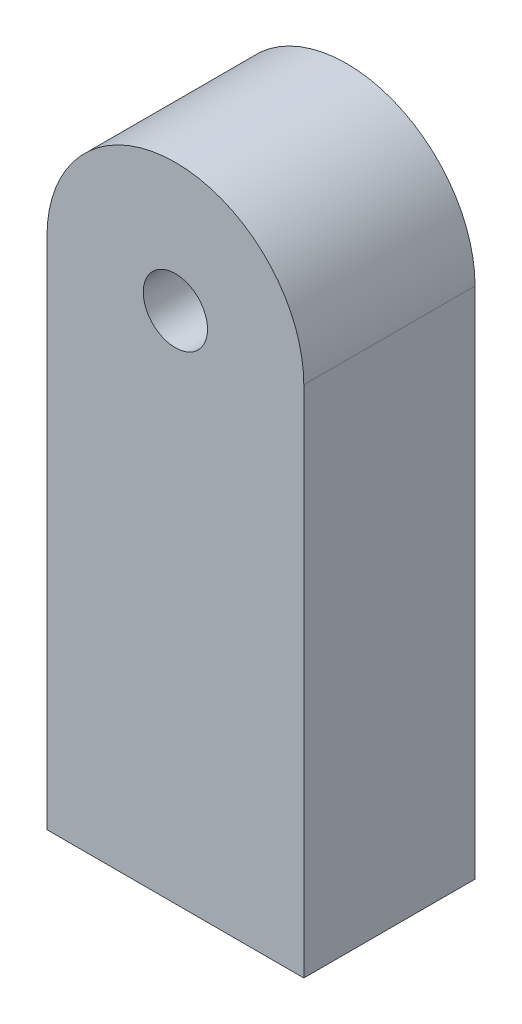
ISO-10303-21;
HEADER;
FILE_DESCRIPTION(('STEP AP214'),'2;1');
FILE_NAME('part.step','',(''),(''),'','','');
FILE_SCHEMA(('AUTOMOTIVE_DESIGN { 1 0 10303 214 1 1 1 1 }'));
ENDSEC;
DATA;
#1=APPLICATION_CONTEXT('core data for automotive mechanical design processes');
#2=APPLICATION_PROTOCOL_DEFINITION('international standard','automotive_design',2000,#1);
#3=PRODUCT_CONTEXT('',#1,'mechanical');
#4=PRODUCT('Part','Part','',(#3));
#5=PRODUCT_RELATED_PRODUCT_CATEGORY('part','',(#4));
#6=PRODUCT_DEFINITION_FORMATION('','',#4);
#7=PRODUCT_DEFINITION_CONTEXT('part definition',#1,'design');
#8=PRODUCT_DEFINITION('design','',#6,#7);
#9=PRODUCT_DEFINITION_SHAPE('','',#8);
#10=(LENGTH_UNIT() NAMED_UNIT(*) SI_UNIT(.MILLI.,.METRE.));
#11=(NAMED_UNIT(*) PLANE_ANGLE_UNIT() SI_UNIT($,.RADIAN.));
#12=(NAMED_UNIT(*) SI_UNIT($,.STERADIAN.) SOLID_ANGLE_UNIT());
#13=UNCERTAINTY_MEASURE_WITH_UNIT(LENGTH_MEASURE(1.E-05),#10,'distance_accuracy_value','');
#14=(GEOMETRIC_REPRESENTATION_CONTEXT(3) GLOBAL_UNCERTAINTY_ASSIGNED_CONTEXT((#13)) GLOBAL_UNIT_ASSIGNED_CONTEXT((#10,
#11,#12)) REPRESENTATION_CONTEXT('',''));
#15=CARTESIAN_POINT('',(0.,0.,0.));
#16=DIRECTION('',(0.,0.,1.));
#17=DIRECTION('',(1.,0.,0.));
#18=AXIS2_PLACEMENT_3D('',#15,#16,#17);
#19=CARTESIAN_POINT('',(19.05,76.2,12.7));
#20=DIRECTION('',(-1.,0.,0.));
#21=DIRECTION('',(0.,0.,1.));
#22=AXIS2_PLACEMENT_3D('',#19,#20,#21);
#23=PLANE('',#22);
#24=DIRECTION('',(0.,0.,-1.));
#25=VECTOR('',#24,1.);
#26=CARTESIAN_POINT('',(19.05,0.,12.7));
#27=LINE('',#26,#25);
#28=CARTESIAN_POINT('',(19.05,0.,12.7));
#29=VERTEX_POINT('',#28);
#30=CARTESIAN_POINT('',(19.05,0.,-12.7));
#31=VERTEX_POINT('',#30);
#32=EDGE_CURVE('E83',#29,#31,#27,.T.);
#33=ORIENTED_EDGE('',*,*,#32,.T.);
#34=DIRECTION('',(0.,-1.,0.));
#35=VECTOR('',#34,1.);
#36=CARTESIAN_POINT('',(19.05,76.2,-12.7));
#37=LINE('',#36,#35);
#38=CARTESIAN_POINT('',(19.05,76.2,-12.7));
#39=VERTEX_POINT('',#38);
#40=EDGE_CURVE('E11',#39,#31,#37,.T.);
#41=ORIENTED_EDGE('',*,*,#40,.F.);
#42=DIRECTION('',(0.,0.,-1.));
#43=VECTOR('',#42,1.);
#44=CARTESIAN_POINT('',(19.05,76.2,12.7));
#45=LINE('',#44,#43);
#46=CARTESIAN_POINT('',(19.05,76.2,12.7));
#47=VERTEX_POINT('',#46);
#48=EDGE_CURVE('E80',#47,#39,#45,.T.);
#49=ORIENTED_EDGE('',*,*,#48,.F.);
#50=DIRECTION('',(0.,-1.,0.));
#51=VECTOR('',#50,1.);
#52=CARTESIAN_POINT('',(19.05,76.2,12.7));
#53=LINE('',#52,#51);
#54=EDGE_CURVE('E49',#47,#29,#53,.T.);
#55=ORIENTED_EDGE('',*,*,#54,.T.);
#56=EDGE_LOOP('',(#33,#41,#49,#55));
#57=FACE_BOUND('',#56,.T.);
#58=ADVANCED_FACE('F33',(#57),#23,.F.);
#59=CARTESIAN_POINT('',(-19.05,76.2,-12.7));
#60=DIRECTION('',(0.,0.,1.));
#61=DIRECTION('',(1.,0.,0.));
#62=AXIS2_PLACEMENT_3D('',#59,#60,#61);
#63=PLANE('',#62);
#64=CARTESIAN_POINT('',(0.,76.2,-12.7));
#65=DIRECTION('',(0.,0.,1.));
#66=DIRECTION('',(1.,0.,0.));
#67=AXIS2_PLACEMENT_3D('',#64,#65,#66);
#68=CIRCLE('',#67,4.7625);
#69=CARTESIAN_POINT('',(4.7625,76.2,-12.7));
#70=VERTEX_POINT('',#69);
#71=EDGE_CURVE('E129',#70,#70,#68,.T.);
#72=ORIENTED_EDGE('',*,*,#71,.T.);
#73=EDGE_LOOP('',(#72));
#74=FACE_BOUND('',#73,.T.);
#75=DIRECTION('',(-1.,0.,0.));
#76=VECTOR('',#75,1.);
#77=CARTESIAN_POINT('',(-19.05,0.,-12.7));
#78=LINE('',#77,#76);
#79=CARTESIAN_POINT('',(-19.05,0.,-12.7));
#80=VERTEX_POINT('',#79);
#81=EDGE_CURVE('E99',#31,#80,#78,.T.);
#82=ORIENTED_EDGE('',*,*,#81,.T.);
#83=DIRECTION('',(0.,-1.,0.));
#84=VECTOR('',#83,1.);
#85=CARTESIAN_POINT('',(-19.05,76.2,-12.7));
#86=LINE('',#85,#84);
#87=CARTESIAN_POINT('',(-19.05,76.2,-12.7));
#88=VERTEX_POINT('',#87);
#89=EDGE_CURVE('E41',#88,#80,#86,.T.);
#90=ORIENTED_EDGE('',*,*,#89,.F.);
#91=CARTESIAN_POINT('',(0.,76.2,-12.7));
#92=DIRECTION('',(0.,0.,-1.));
#93=DIRECTION('',(-1.,0.,0.));
#94=AXIS2_PLACEMENT_3D('',#91,#92,#93);
#95=CIRCLE('',#94,19.05);
#96=EDGE_CURVE('E85',#88,#39,#95,.T.);
#97=ORIENTED_EDGE('',*,*,#96,.T.);
#98=ORIENTED_EDGE('',*,*,#40,.T.);
#99=EDGE_LOOP('',(#82,#90,#97,#98));
#100=FACE_BOUND('',#99,.T.);
#101=ADVANCED_FACE('F86',(#74,#100),#63,.F.);
#102=CARTESIAN_POINT('',(-19.05,76.2,12.7));
#103=DIRECTION('',(1.,0.,0.));
#104=DIRECTION('',(0.,0.,-1.));
#105=AXIS2_PLACEMENT_3D('',#102,#103,#104);
#106=PLANE('',#105);
#107=DIRECTION('',(0.,0.,1.));
#108=VECTOR('',#107,1.);
#109=CARTESIAN_POINT('',(-19.05,0.,12.7));
#110=LINE('',#109,#108);
#111=CARTESIAN_POINT('',(-19.05,0.,12.7));
#112=VERTEX_POINT('',#111);
#113=EDGE_CURVE('E67',#80,#112,#110,.T.);
#114=ORIENTED_EDGE('',*,*,#113,.T.);
#115=DIRECTION('',(0.,-1.,0.));
#116=VECTOR('',#115,1.);
#117=CARTESIAN_POINT('',(-19.05,76.2,12.7));
#118=LINE('',#117,#116);
#119=CARTESIAN_POINT('',(-19.05,76.2,12.7));
#120=VERTEX_POINT('',#119);
#121=EDGE_CURVE('E103',#120,#112,#118,.T.);
#122=ORIENTED_EDGE('',*,*,#121,.F.);
#123=DIRECTION('',(0.,0.,1.));
#124=VECTOR('',#123,1.);
#125=CARTESIAN_POINT('',(-19.05,76.2,12.7));
#126=LINE('',#125,#124);
#127=EDGE_CURVE('E92',#88,#120,#126,.T.);
#128=ORIENTED_EDGE('',*,*,#127,.F.);
#129=ORIENTED_EDGE('',*,*,#89,.T.);
#130=EDGE_LOOP('',(#114,#122,#128,#129));
#131=FACE_BOUND('',#130,.T.);
#132=ADVANCED_FACE('F104',(#131),#106,.F.);
#133=CARTESIAN_POINT('',(-19.05,76.2,12.7));
#134=DIRECTION('',(0.,0.,-1.));
#135=DIRECTION('',(-1.,0.,0.));
#136=AXIS2_PLACEMENT_3D('',#133,#134,#135);
#137=PLANE('',#136);
#138=CARTESIAN_POINT('',(0.,76.2,12.7));
#139=DIRECTION('',(0.,0.,1.));
#140=DIRECTION('',(1.,0.,0.));
#141=AXIS2_PLACEMENT_3D('',#138,#139,#140);
#142=CIRCLE('',#141,4.7625);
#143=CARTESIAN_POINT('',(4.7625,76.2,12.7));
#144=VERTEX_POINT('',#143);
#145=EDGE_CURVE('E131',#144,#144,#142,.T.);
#146=ORIENTED_EDGE('',*,*,#145,.F.);
#147=EDGE_LOOP('',(#146));
#148=FACE_BOUND('',#147,.T.);
#149=DIRECTION('',(1.,0.,0.));
#150=VECTOR('',#149,1.);
#151=CARTESIAN_POINT('',(-19.05,0.,12.7));
#152=LINE('',#151,#150);
#153=EDGE_CURVE('E70',#112,#29,#152,.T.);
#154=ORIENTED_EDGE('',*,*,#153,.T.);
#155=ORIENTED_EDGE('',*,*,#54,.F.);
#156=CARTESIAN_POINT('',(0.,76.2,12.7));
#157=DIRECTION('',(0.,0.,-1.));
#158=DIRECTION('',(-1.,0.,0.));
#159=AXIS2_PLACEMENT_3D('',#156,#157,#158);
#160=CIRCLE('',#159,19.05);
#161=EDGE_CURVE('E89',#120,#47,#160,.T.);
#162=ORIENTED_EDGE('',*,*,#161,.F.);
#163=ORIENTED_EDGE('',*,*,#121,.T.);
#164=EDGE_LOOP('',(#154,#155,#162,#163));
#165=FACE_BOUND('',#164,.T.);
#166=ADVANCED_FACE('F108',(#148,#165),#137,.F.);
#167=CARTESIAN_POINT('',(0.,0.,0.));
#168=DIRECTION('',(0.,-1.,0.));
#169=DIRECTION('',(0.,0.,-1.));
#170=AXIS2_PLACEMENT_3D('',#167,#168,#169);
#171=PLANE('',#170);
#172=ORIENTED_EDGE('',*,*,#32,.F.);
#173=ORIENTED_EDGE('',*,*,#153,.F.);
#174=ORIENTED_EDGE('',*,*,#113,.F.);
#175=ORIENTED_EDGE('',*,*,#81,.F.);
#176=EDGE_LOOP('',(#172,#173,#174,#175));
#177=FACE_BOUND('',#176,.T.);
#178=ADVANCED_FACE('F106',(#177),#171,.T.);
#179=CARTESIAN_POINT('',(0.,76.2,-12.7));
#180=DIRECTION('',(0.,0.,-1.));
#181=DIRECTION('',(-1.,0.,0.));
#182=AXIS2_PLACEMENT_3D('',#179,#180,#181);
#183=CYLINDRICAL_SURFACE('',#182,19.05);
#184=ORIENTED_EDGE('',*,*,#127,.T.);
#185=ORIENTED_EDGE('',*,*,#161,.T.);
#186=ORIENTED_EDGE('',*,*,#48,.T.);
#187=ORIENTED_EDGE('',*,*,#96,.F.);
#188=EDGE_LOOP('',(#184,#185,#186,#187));
#189=FACE_BOUND('',#188,.T.);
#190=ADVANCED_FACE('F91',(#189),#183,.T.);
#191=CARTESIAN_POINT('',(0.,76.2,-12.7));
#192=DIRECTION('',(0.,0.,1.));
#193=DIRECTION('',(1.,0.,0.));
#194=AXIS2_PLACEMENT_3D('',#191,#192,#193);
#195=CYLINDRICAL_SURFACE('',#194,4.7625);
#196=ORIENTED_EDGE('',*,*,#71,.F.);
#197=EDGE_LOOP('',(#196));
#198=FACE_BOUND('',#197,.T.);
#199=ORIENTED_EDGE('',*,*,#145,.T.);
#200=EDGE_LOOP('',(#199));
#201=FACE_BOUND('',#200,.T.);
#202=ADVANCED_FACE('F114',(#198,#201),#195,.F.);
#203=CLOSED_SHELL('',(#58,#101,#132,#166,#178,#190,#202));
#204=MANIFOLD_SOLID_BREP('B2',#203);
#205=ADVANCED_BREP_SHAPE_REPRESENTATION('',(#18,#204),#14);
#206=SHAPE_DEFINITION_REPRESENTATION(#9,#205);
ENDSEC;
END-ISO-10303-21;
